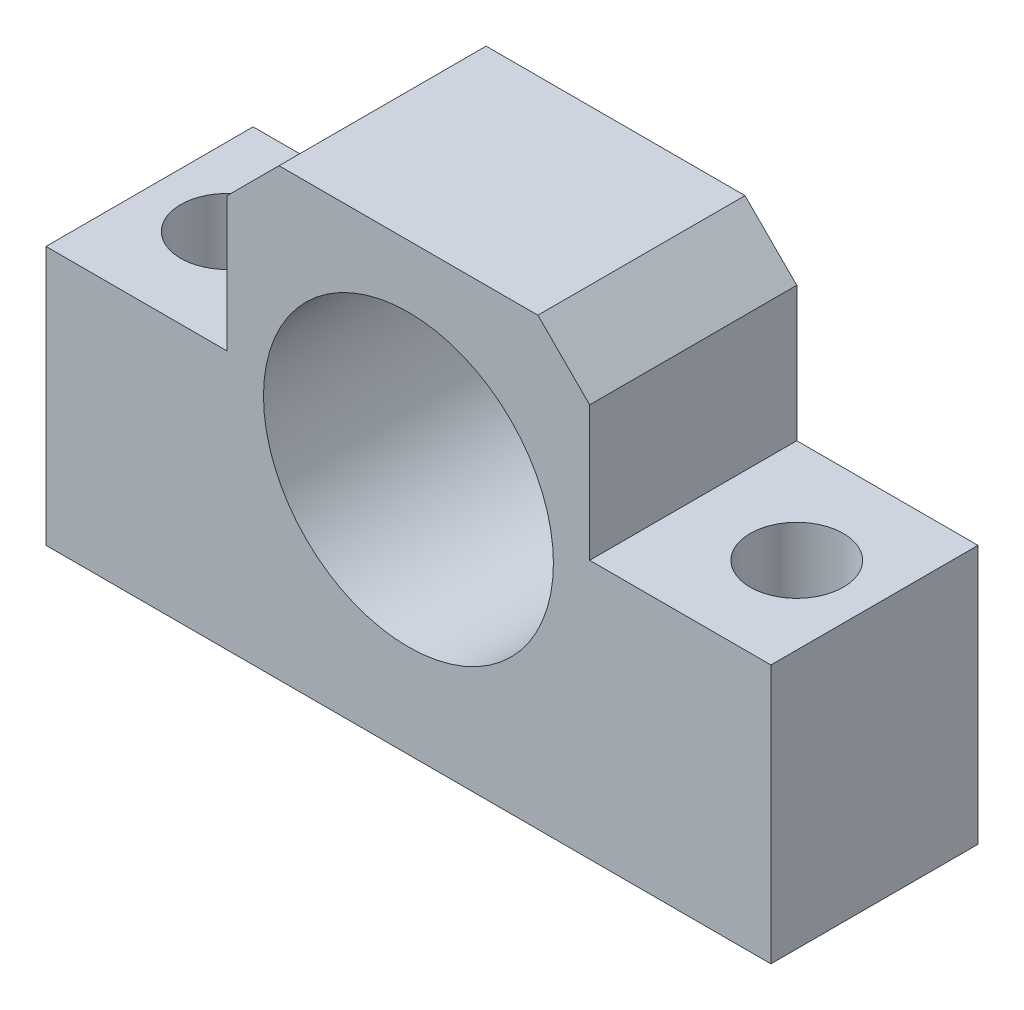
ISO-10303-21;
HEADER;
FILE_DESCRIPTION(('STEP AP214'),'2;1');
FILE_NAME('part.step','',(''),(''),'','','');
FILE_SCHEMA(('AUTOMOTIVE_DESIGN { 1 0 10303 214 1 1 1 1 }'));
ENDSEC;
DATA;
#1=APPLICATION_CONTEXT('core data for automotive mechanical design processes');
#2=APPLICATION_PROTOCOL_DEFINITION('international standard','automotive_design',2000,#1);
#3=PRODUCT_CONTEXT('',#1,'mechanical');
#4=PRODUCT('Part','Part','',(#3));
#5=PRODUCT_RELATED_PRODUCT_CATEGORY('part','',(#4));
#6=PRODUCT_DEFINITION_FORMATION('','',#4);
#7=PRODUCT_DEFINITION_CONTEXT('part definition',#1,'design');
#8=PRODUCT_DEFINITION('design','',#6,#7);
#9=PRODUCT_DEFINITION_SHAPE('','',#8);
#10=(LENGTH_UNIT() NAMED_UNIT(*) SI_UNIT(.MILLI.,.METRE.));
#11=(NAMED_UNIT(*) PLANE_ANGLE_UNIT() SI_UNIT($,.RADIAN.));
#12=(NAMED_UNIT(*) SI_UNIT($,.STERADIAN.) SOLID_ANGLE_UNIT());
#13=UNCERTAINTY_MEASURE_WITH_UNIT(LENGTH_MEASURE(1.E-05),#10,'distance_accuracy_value','');
#14=(GEOMETRIC_REPRESENTATION_CONTEXT(3) GLOBAL_UNCERTAINTY_ASSIGNED_CONTEXT((#13)) GLOBAL_UNIT_ASSIGNED_CONTEXT((#10,
#11,#12)) REPRESENTATION_CONTEXT('',''));
#15=CARTESIAN_POINT('',(0.,0.,0.));
#16=DIRECTION('',(0.,0.,1.));
#17=DIRECTION('',(1.,0.,0.));
#18=AXIS2_PLACEMENT_3D('',#15,#16,#17);
#19=CARTESIAN_POINT('',(-35.,-12.5,0.));
#20=DIRECTION('',(0.,-1.,0.));
#21=DIRECTION('',(0.,0.,-1.));
#22=AXIS2_PLACEMENT_3D('',#19,#20,#21);
#23=PLANE('',#22);
#24=CARTESIAN_POINT('',(-27.5,-12.5,10.));
#25=DIRECTION('',(0.,-1.,0.));
#26=DIRECTION('',(0.,0.,-1.));
#27=AXIS2_PLACEMENT_3D('',#24,#25,#26);
#28=CIRCLE('',#27,4.49999999999999);
#29=CARTESIAN_POINT('',(-27.5,-12.5,5.50000000000002));
#30=VERTEX_POINT('',#29);
#31=EDGE_CURVE('E377',#30,#30,#28,.T.);
#32=ORIENTED_EDGE('',*,*,#31,.F.);
#33=EDGE_LOOP('',(#32));
#34=FACE_BOUND('',#33,.T.);
#35=DIRECTION('',(1.,0.,0.));
#36=VECTOR('',#35,1.);
#37=CARTESIAN_POINT('',(-35.,-12.5,20.));
#38=LINE('',#37,#36);
#39=CARTESIAN_POINT('',(-35.,-12.5,20.));
#40=VERTEX_POINT('',#39);
#41=CARTESIAN_POINT('',(35.,-12.5,20.));
#42=VERTEX_POINT('',#41);
#43=EDGE_CURVE('E151',#40,#42,#38,.T.);
#44=ORIENTED_EDGE('',*,*,#43,.F.);
#45=DIRECTION('',(0.,0.,1.));
#46=VECTOR('',#45,1.);
#47=CARTESIAN_POINT('',(-35.,-12.5,0.));
#48=LINE('',#47,#46);
#49=CARTESIAN_POINT('',(-35.,-12.5,0.));
#50=VERTEX_POINT('',#49);
#51=EDGE_CURVE('E169',#50,#40,#48,.T.);
#52=ORIENTED_EDGE('',*,*,#51,.F.);
#53=DIRECTION('',(1.,0.,0.));
#54=VECTOR('',#53,1.);
#55=CARTESIAN_POINT('',(-35.,-12.5,0.));
#56=LINE('',#55,#54);
#57=CARTESIAN_POINT('',(35.,-12.5,0.));
#58=VERTEX_POINT('',#57);
#59=EDGE_CURVE('E240',#50,#58,#56,.T.);
#60=ORIENTED_EDGE('',*,*,#59,.T.);
#61=DIRECTION('',(0.,0.,1.));
#62=VECTOR('',#61,1.);
#63=CARTESIAN_POINT('',(35.,-12.5,0.));
#64=LINE('',#63,#62);
#65=EDGE_CURVE('E165',#58,#42,#64,.T.);
#66=ORIENTED_EDGE('',*,*,#65,.T.);
#67=EDGE_LOOP('',(#44,#52,#60,#66));
#68=FACE_BOUND('',#67,.T.);
#69=CARTESIAN_POINT('',(27.5,-12.5,10.));
#70=DIRECTION('',(0.,1.,0.));
#71=DIRECTION('',(0.,0.,1.));
#72=AXIS2_PLACEMENT_3D('',#69,#70,#71);
#73=CIRCLE('',#72,4.49999999999998);
#74=CARTESIAN_POINT('',(27.5,-12.5,14.5));
#75=VERTEX_POINT('',#74);
#76=EDGE_CURVE('E212',#75,#75,#73,.T.);
#77=ORIENTED_EDGE('',*,*,#76,.T.);
#78=EDGE_LOOP('',(#77));
#79=FACE_BOUND('',#78,.T.);
#80=ADVANCED_FACE('F45',(#34,#68,#79),#23,.T.);
#81=CARTESIAN_POINT('',(35.,30.5,0.));
#82=DIRECTION('',(0.,1.,0.));
#83=DIRECTION('',(-1.,0.,0.));
#84=AXIS2_PLACEMENT_3D('',#81,#82,#83);
#85=PLANE('',#84);
#86=DIRECTION('',(-1.,0.,0.));
#87=VECTOR('',#86,1.);
#88=CARTESIAN_POINT('',(35.,30.5,20.));
#89=LINE('',#88,#87);
#90=CARTESIAN_POINT('',(12.5,30.5,20.));
#91=VERTEX_POINT('',#90);
#92=CARTESIAN_POINT('',(-12.5,30.5,20.));
#93=VERTEX_POINT('',#92);
#94=EDGE_CURVE('E192',#91,#93,#89,.T.);
#95=ORIENTED_EDGE('',*,*,#94,.F.);
#96=DIRECTION('',(0.,0.,-1.));
#97=VECTOR('',#96,1.);
#98=CARTESIAN_POINT('',(12.5,30.5,0.));
#99=LINE('',#98,#97);
#100=CARTESIAN_POINT('',(12.5,30.5,0.));
#101=VERTEX_POINT('',#100);
#102=EDGE_CURVE('E175',#91,#101,#99,.T.);
#103=ORIENTED_EDGE('',*,*,#102,.T.);
#104=DIRECTION('',(-1.,0.,0.));
#105=VECTOR('',#104,1.);
#106=CARTESIAN_POINT('',(35.,30.5,0.));
#107=LINE('',#106,#105);
#108=CARTESIAN_POINT('',(-12.5,30.5,0.));
#109=VERTEX_POINT('',#108);
#110=EDGE_CURVE('E153',#101,#109,#107,.T.);
#111=ORIENTED_EDGE('',*,*,#110,.T.);
#112=DIRECTION('',(0.,0.,1.));
#113=VECTOR('',#112,1.);
#114=CARTESIAN_POINT('',(-12.5,30.5,20.));
#115=LINE('',#114,#113);
#116=EDGE_CURVE('E168',#109,#93,#115,.T.);
#117=ORIENTED_EDGE('',*,*,#116,.T.);
#118=EDGE_LOOP('',(#95,#103,#111,#117));
#119=FACE_BOUND('',#118,.T.);
#120=ADVANCED_FACE('F196',(#119),#85,.T.);
#121=CARTESIAN_POINT('',(35.,-12.5,0.));
#122=DIRECTION('',(1.,0.,0.));
#123=DIRECTION('',(0.,0.,-1.));
#124=AXIS2_PLACEMENT_3D('',#121,#122,#123);
#125=PLANE('',#124);
#126=DIRECTION('',(0.,0.,-1.));
#127=VECTOR('',#126,1.);
#128=CARTESIAN_POINT('',(35.,12.5,20.));
#129=LINE('',#128,#127);
#130=CARTESIAN_POINT('',(35.,12.5,20.));
#131=VERTEX_POINT('',#130);
#132=CARTESIAN_POINT('',(35.,12.5,0.));
#133=VERTEX_POINT('',#132);
#134=EDGE_CURVE('E130',#131,#133,#129,.T.);
#135=ORIENTED_EDGE('',*,*,#134,.F.);
#136=DIRECTION('',(0.,1.,0.));
#137=VECTOR('',#136,1.);
#138=CARTESIAN_POINT('',(35.,-12.5,20.));
#139=LINE('',#138,#137);
#140=EDGE_CURVE('E142',#42,#131,#139,.T.);
#141=ORIENTED_EDGE('',*,*,#140,.F.);
#142=ORIENTED_EDGE('',*,*,#65,.F.);
#143=DIRECTION('',(0.,1.,0.));
#144=VECTOR('',#143,1.);
#145=CARTESIAN_POINT('',(35.,-12.5,0.));
#146=LINE('',#145,#144);
#147=EDGE_CURVE('E144',#58,#133,#146,.T.);
#148=ORIENTED_EDGE('',*,*,#147,.T.);
#149=EDGE_LOOP('',(#135,#141,#142,#148));
#150=FACE_BOUND('',#149,.T.);
#151=ADVANCED_FACE('F141',(#150),#125,.T.);
#152=CARTESIAN_POINT('',(-35.,30.5,0.));
#153=DIRECTION('',(-1.,0.,0.));
#154=DIRECTION('',(0.,0.,1.));
#155=AXIS2_PLACEMENT_3D('',#152,#153,#154);
#156=PLANE('',#155);
#157=DIRECTION('',(0.,0.,-1.));
#158=VECTOR('',#157,1.);
#159=CARTESIAN_POINT('',(-35.,12.5,20.));
#160=LINE('',#159,#158);
#161=CARTESIAN_POINT('',(-35.,12.5,20.));
#162=VERTEX_POINT('',#161);
#163=CARTESIAN_POINT('',(-35.,12.5,0.));
#164=VERTEX_POINT('',#163);
#165=EDGE_CURVE('E200',#162,#164,#160,.T.);
#166=ORIENTED_EDGE('',*,*,#165,.T.);
#167=DIRECTION('',(0.,-1.,0.));
#168=VECTOR('',#167,1.);
#169=CARTESIAN_POINT('',(-35.,30.5,0.));
#170=LINE('',#169,#168);
#171=EDGE_CURVE('E159',#164,#50,#170,.T.);
#172=ORIENTED_EDGE('',*,*,#171,.T.);
#173=ORIENTED_EDGE('',*,*,#51,.T.);
#174=DIRECTION('',(0.,-1.,0.));
#175=VECTOR('',#174,1.);
#176=CARTESIAN_POINT('',(-35.,30.5,20.));
#177=LINE('',#176,#175);
#178=EDGE_CURVE('E161',#162,#40,#177,.T.);
#179=ORIENTED_EDGE('',*,*,#178,.F.);
#180=EDGE_LOOP('',(#166,#172,#173,#179));
#181=FACE_BOUND('',#180,.T.);
#182=ADVANCED_FACE('F251',(#181),#156,.T.);
#183=CARTESIAN_POINT('',(0.,0.,0.));
#184=DIRECTION('',(0.,0.,1.));
#185=DIRECTION('',(1.,0.,0.));
#186=AXIS2_PLACEMENT_3D('',#183,#184,#185);
#187=PLANE('',#186);
#188=CARTESIAN_POINT('',(0.,10.5,0.));
#189=DIRECTION('',(0.,0.,-1.));
#190=DIRECTION('',(-1.,0.,0.));
#191=AXIS2_PLACEMENT_3D('',#188,#189,#190);
#192=CIRCLE('',#191,14.);
#193=CARTESIAN_POINT('',(-14.,10.5,0.));
#194=VERTEX_POINT('',#193);
#195=EDGE_CURVE('E416',#194,#194,#192,.T.);
#196=ORIENTED_EDGE('',*,*,#195,.F.);
#197=EDGE_LOOP('',(#196));
#198=FACE_BOUND('',#197,.T.);
#199=ORIENTED_EDGE('',*,*,#110,.F.);
#200=DIRECTION('',(0.707106781186545,-0.707106781186549,0.));
#201=VECTOR('',#200,1.);
#202=CARTESIAN_POINT('',(12.5,30.5,0.));
#203=LINE('',#202,#201);
#204=CARTESIAN_POINT('',(17.5,25.5,0.));
#205=VERTEX_POINT('',#204);
#206=EDGE_CURVE('E182',#101,#205,#203,.T.);
#207=ORIENTED_EDGE('',*,*,#206,.T.);
#208=DIRECTION('',(0.,1.,0.));
#209=VECTOR('',#208,1.);
#210=CARTESIAN_POINT('',(17.5,12.5,0.));
#211=LINE('',#210,#209);
#212=CARTESIAN_POINT('',(17.5,12.5,0.));
#213=VERTEX_POINT('',#212);
#214=EDGE_CURVE('E136',#213,#205,#211,.T.);
#215=ORIENTED_EDGE('',*,*,#214,.F.);
#216=DIRECTION('',(-1.,0.,0.));
#217=VECTOR('',#216,1.);
#218=CARTESIAN_POINT('',(35.,12.5,0.));
#219=LINE('',#218,#217);
#220=EDGE_CURVE('E208',#133,#213,#219,.T.);
#221=ORIENTED_EDGE('',*,*,#220,.F.);
#222=ORIENTED_EDGE('',*,*,#147,.F.);
#223=ORIENTED_EDGE('',*,*,#59,.F.);
#224=ORIENTED_EDGE('',*,*,#171,.F.);
#225=DIRECTION('',(-1.,0.,0.));
#226=VECTOR('',#225,1.);
#227=CARTESIAN_POINT('',(-17.5,12.5,0.));
#228=LINE('',#227,#226);
#229=CARTESIAN_POINT('',(-17.5,12.5,0.));
#230=VERTEX_POINT('',#229);
#231=EDGE_CURVE('E223',#230,#164,#228,.T.);
#232=ORIENTED_EDGE('',*,*,#231,.F.);
#233=DIRECTION('',(0.,-1.,0.));
#234=VECTOR('',#233,1.);
#235=CARTESIAN_POINT('',(-17.5,30.5,0.));
#236=LINE('',#235,#234);
#237=CARTESIAN_POINT('',(-17.5,25.5,0.));
#238=VERTEX_POINT('',#237);
#239=EDGE_CURVE('E217',#238,#230,#236,.T.);
#240=ORIENTED_EDGE('',*,*,#239,.F.);
#241=DIRECTION('',(0.707106781186549,0.707106781186546,0.));
#242=VECTOR('',#241,1.);
#243=CARTESIAN_POINT('',(-17.5,25.5,0.));
#244=LINE('',#243,#242);
#245=EDGE_CURVE('E179',#238,#109,#244,.T.);
#246=ORIENTED_EDGE('',*,*,#245,.T.);
#247=EDGE_LOOP('',(#199,#207,#215,#221,#222,#223,#224,#232,#240,#246));
#248=FACE_BOUND('',#247,.T.);
#249=ADVANCED_FACE('F205',(#198,#248),#187,.F.);
#250=CARTESIAN_POINT('',(0.,0.,20.));
#251=DIRECTION('',(0.,0.,1.));
#252=DIRECTION('',(1.,0.,0.));
#253=AXIS2_PLACEMENT_3D('',#250,#251,#252);
#254=PLANE('',#253);
#255=DIRECTION('',(0.,1.,0.));
#256=VECTOR('',#255,1.);
#257=CARTESIAN_POINT('',(17.5,12.5,20.));
#258=LINE('',#257,#256);
#259=CARTESIAN_POINT('',(17.5,12.5,20.));
#260=VERTEX_POINT('',#259);
#261=CARTESIAN_POINT('',(17.5,25.5,20.));
#262=VERTEX_POINT('',#261);
#263=EDGE_CURVE('E135',#260,#262,#258,.T.);
#264=ORIENTED_EDGE('',*,*,#263,.T.);
#265=DIRECTION('',(-0.707106781186545,0.707106781186549,0.));
#266=VECTOR('',#265,1.);
#267=CARTESIAN_POINT('',(21.5,21.4999999999999,20.));
#268=LINE('',#267,#266);
#269=EDGE_CURVE('E55',#262,#91,#268,.T.);
#270=ORIENTED_EDGE('',*,*,#269,.T.);
#271=ORIENTED_EDGE('',*,*,#94,.T.);
#272=DIRECTION('',(-0.707106781186549,-0.707106781186546,0.));
#273=VECTOR('',#272,1.);
#274=CARTESIAN_POINT('',(-21.4999999999999,21.5000000000001,20.));
#275=LINE('',#274,#273);
#276=CARTESIAN_POINT('',(-17.5,25.5,20.));
#277=VERTEX_POINT('',#276);
#278=EDGE_CURVE('E62',#93,#277,#275,.T.);
#279=ORIENTED_EDGE('',*,*,#278,.T.);
#280=DIRECTION('',(0.,-1.,0.));
#281=VECTOR('',#280,1.);
#282=CARTESIAN_POINT('',(-17.5,30.5,20.));
#283=LINE('',#282,#281);
#284=CARTESIAN_POINT('',(-17.5,12.5,20.));
#285=VERTEX_POINT('',#284);
#286=EDGE_CURVE('E219',#277,#285,#283,.T.);
#287=ORIENTED_EDGE('',*,*,#286,.T.);
#288=DIRECTION('',(-1.,0.,0.));
#289=VECTOR('',#288,1.);
#290=CARTESIAN_POINT('',(-17.5,12.5,20.));
#291=LINE('',#290,#289);
#292=EDGE_CURVE('E222',#285,#162,#291,.T.);
#293=ORIENTED_EDGE('',*,*,#292,.T.);
#294=ORIENTED_EDGE('',*,*,#178,.T.);
#295=ORIENTED_EDGE('',*,*,#43,.T.);
#296=ORIENTED_EDGE('',*,*,#140,.T.);
#297=DIRECTION('',(-1.,0.,0.));
#298=VECTOR('',#297,1.);
#299=CARTESIAN_POINT('',(35.,12.5,20.));
#300=LINE('',#299,#298);
#301=EDGE_CURVE('E126',#131,#260,#300,.T.);
#302=ORIENTED_EDGE('',*,*,#301,.T.);
#303=EDGE_LOOP('',(#264,#270,#271,#279,#287,#293,#294,#295,#296,#302));
#304=FACE_BOUND('',#303,.T.);
#305=CARTESIAN_POINT('',(0.,10.5,20.));
#306=DIRECTION('',(0.,0.,1.));
#307=DIRECTION('',(1.,0.,0.));
#308=AXIS2_PLACEMENT_3D('',#305,#306,#307);
#309=CIRCLE('',#308,14.);
#310=CARTESIAN_POINT('',(-14.,10.5,20.));
#311=VERTEX_POINT('',#310);
#312=EDGE_CURVE('E389',#311,#311,#309,.T.);
#313=ORIENTED_EDGE('',*,*,#312,.F.);
#314=EDGE_LOOP('',(#313));
#315=FACE_BOUND('',#314,.T.);
#316=ADVANCED_FACE('F148',(#304,#315),#254,.T.);
#317=CARTESIAN_POINT('',(-17.5,12.5,20.));
#318=DIRECTION('',(0.,-1.,0.));
#319=DIRECTION('',(0.,0.,-1.));
#320=AXIS2_PLACEMENT_3D('',#317,#318,#319);
#321=PLANE('',#320);
#322=CARTESIAN_POINT('',(-27.5,12.5,10.));
#323=DIRECTION('',(0.,-1.,0.));
#324=DIRECTION('',(0.,0.,-1.));
#325=AXIS2_PLACEMENT_3D('',#322,#323,#324);
#326=CIRCLE('',#325,4.49999999999999);
#327=CARTESIAN_POINT('',(-27.5,12.5,5.50000000000002));
#328=VERTEX_POINT('',#327);
#329=EDGE_CURVE('E380',#328,#328,#326,.T.);
#330=ORIENTED_EDGE('',*,*,#329,.T.);
#331=EDGE_LOOP('',(#330));
#332=FACE_BOUND('',#331,.T.);
#333=ORIENTED_EDGE('',*,*,#231,.T.);
#334=ORIENTED_EDGE('',*,*,#165,.F.);
#335=ORIENTED_EDGE('',*,*,#292,.F.);
#336=DIRECTION('',(0.,0.,-1.));
#337=VECTOR('',#336,1.);
#338=CARTESIAN_POINT('',(-17.5,12.5,20.));
#339=LINE('',#338,#337);
#340=EDGE_CURVE('E227',#285,#230,#339,.T.);
#341=ORIENTED_EDGE('',*,*,#340,.T.);
#342=EDGE_LOOP('',(#333,#334,#335,#341));
#343=FACE_BOUND('',#342,.T.);
#344=ADVANCED_FACE('F259',(#332,#343),#321,.F.);
#345=CARTESIAN_POINT('',(-17.5,30.5,20.));
#346=DIRECTION('',(1.,0.,0.));
#347=DIRECTION('',(0.,0.,-1.));
#348=AXIS2_PLACEMENT_3D('',#345,#346,#347);
#349=PLANE('',#348);
#350=ORIENTED_EDGE('',*,*,#286,.F.);
#351=DIRECTION('',(0.,0.,-1.));
#352=VECTOR('',#351,1.);
#353=CARTESIAN_POINT('',(-17.5,25.5,0.));
#354=LINE('',#353,#352);
#355=EDGE_CURVE('E11',#277,#238,#354,.T.);
#356=ORIENTED_EDGE('',*,*,#355,.T.);
#357=ORIENTED_EDGE('',*,*,#239,.T.);
#358=ORIENTED_EDGE('',*,*,#340,.F.);
#359=EDGE_LOOP('',(#350,#356,#357,#358));
#360=FACE_BOUND('',#359,.T.);
#361=ADVANCED_FACE('F262',(#360),#349,.F.);
#362=CARTESIAN_POINT('',(17.5,12.5,20.));
#363=DIRECTION('',(-1.,0.,0.));
#364=DIRECTION('',(0.,-1.,0.));
#365=AXIS2_PLACEMENT_3D('',#362,#363,#364);
#366=PLANE('',#365);
#367=ORIENTED_EDGE('',*,*,#214,.T.);
#368=DIRECTION('',(0.,0.,1.));
#369=VECTOR('',#368,1.);
#370=CARTESIAN_POINT('',(17.5,25.5,20.));
#371=LINE('',#370,#369);
#372=EDGE_CURVE('E70',#205,#262,#371,.T.);
#373=ORIENTED_EDGE('',*,*,#372,.T.);
#374=ORIENTED_EDGE('',*,*,#263,.F.);
#375=DIRECTION('',(0.,0.,-1.));
#376=VECTOR('',#375,1.);
#377=CARTESIAN_POINT('',(17.5,12.5,20.));
#378=LINE('',#377,#376);
#379=EDGE_CURVE('E132',#260,#213,#378,.T.);
#380=ORIENTED_EDGE('',*,*,#379,.T.);
#381=EDGE_LOOP('',(#367,#373,#374,#380));
#382=FACE_BOUND('',#381,.T.);
#383=ADVANCED_FACE('F206',(#382),#366,.F.);
#384=CARTESIAN_POINT('',(35.,12.5,20.));
#385=DIRECTION('',(0.,-1.,0.));
#386=DIRECTION('',(1.,0.,0.));
#387=AXIS2_PLACEMENT_3D('',#384,#385,#386);
#388=PLANE('',#387);
#389=CARTESIAN_POINT('',(27.5,12.5,10.));
#390=DIRECTION('',(0.,1.,0.));
#391=DIRECTION('',(0.,0.,1.));
#392=AXIS2_PLACEMENT_3D('',#389,#390,#391);
#393=CIRCLE('',#392,4.49999999999998);
#394=CARTESIAN_POINT('',(27.5,12.5,14.5));
#395=VERTEX_POINT('',#394);
#396=EDGE_CURVE('E382',#395,#395,#393,.T.);
#397=ORIENTED_EDGE('',*,*,#396,.F.);
#398=EDGE_LOOP('',(#397));
#399=FACE_BOUND('',#398,.T.);
#400=ORIENTED_EDGE('',*,*,#220,.T.);
#401=ORIENTED_EDGE('',*,*,#379,.F.);
#402=ORIENTED_EDGE('',*,*,#301,.F.);
#403=ORIENTED_EDGE('',*,*,#134,.T.);
#404=EDGE_LOOP('',(#400,#401,#402,#403));
#405=FACE_BOUND('',#404,.T.);
#406=ADVANCED_FACE('F129',(#399,#405),#388,.F.);
#407=CARTESIAN_POINT('',(27.5,12.5,10.));
#408=DIRECTION('',(0.,1.,0.));
#409=DIRECTION('',(0.,0.,1.));
#410=AXIS2_PLACEMENT_3D('',#407,#408,#409);
#411=CYLINDRICAL_SURFACE('',#410,4.49999999999998);
#412=ORIENTED_EDGE('',*,*,#76,.F.);
#413=EDGE_LOOP('',(#412));
#414=FACE_BOUND('',#413,.T.);
#415=ORIENTED_EDGE('',*,*,#396,.T.);
#416=EDGE_LOOP('',(#415));
#417=FACE_BOUND('',#416,.T.);
#418=ADVANCED_FACE('F341',(#414,#417),#411,.F.);
#419=CARTESIAN_POINT('',(-27.5,-12.5,10.));
#420=DIRECTION('',(0.,-1.,0.));
#421=DIRECTION('',(0.,0.,-1.));
#422=AXIS2_PLACEMENT_3D('',#419,#420,#421);
#423=CYLINDRICAL_SURFACE('',#422,4.49999999999999);
#424=ORIENTED_EDGE('',*,*,#31,.T.);
#425=EDGE_LOOP('',(#424));
#426=FACE_BOUND('',#425,.T.);
#427=ORIENTED_EDGE('',*,*,#329,.F.);
#428=EDGE_LOOP('',(#427));
#429=FACE_BOUND('',#428,.T.);
#430=ADVANCED_FACE('F275',(#426,#429),#423,.F.);
#431=CARTESIAN_POINT('',(12.5,30.5,0.));
#432=DIRECTION('',(0.707106781186549,0.707106781186546,0.));
#433=DIRECTION('',(0.,0.,1.));
#434=AXIS2_PLACEMENT_3D('',#431,#432,#433);
#435=PLANE('',#434);
#436=ORIENTED_EDGE('',*,*,#269,.F.);
#437=ORIENTED_EDGE('',*,*,#372,.F.);
#438=ORIENTED_EDGE('',*,*,#206,.F.);
#439=ORIENTED_EDGE('',*,*,#102,.F.);
#440=EDGE_LOOP('',(#436,#437,#438,#439));
#441=FACE_BOUND('',#440,.T.);
#442=ADVANCED_FACE('F202',(#441),#435,.T.);
#443=CARTESIAN_POINT('',(-17.5,25.5,20.));
#444=DIRECTION('',(-0.707106781186545,0.707106781186549,0.));
#445=DIRECTION('',(0.,0.,1.));
#446=AXIS2_PLACEMENT_3D('',#443,#444,#445);
#447=PLANE('',#446);
#448=ORIENTED_EDGE('',*,*,#278,.F.);
#449=ORIENTED_EDGE('',*,*,#116,.F.);
#450=ORIENTED_EDGE('',*,*,#245,.F.);
#451=ORIENTED_EDGE('',*,*,#355,.F.);
#452=EDGE_LOOP('',(#448,#449,#450,#451));
#453=FACE_BOUND('',#452,.T.);
#454=ADVANCED_FACE('F48',(#453),#447,.T.);
#455=CARTESIAN_POINT('',(0.,10.5,65.254833995939));
#456=DIRECTION('',(0.,0.,-1.));
#457=DIRECTION('',(-1.,0.,0.));
#458=AXIS2_PLACEMENT_3D('',#455,#456,#457);
#459=CYLINDRICAL_SURFACE('',#458,14.);
#460=CARTESIAN_POINT('',(-14.,10.5,20.));
#461=CARTESIAN_POINT('',(-14.,10.5,19.7916666666667));
#462=CARTESIAN_POINT('',(-14.,10.5,19.5833333333333));
#463=CARTESIAN_POINT('',(-14.,10.5,19.1666666666667));
#464=CARTESIAN_POINT('',(-14.,10.5,18.9583333333333));
#465=CARTESIAN_POINT('',(-14.,10.5,18.5416666666667));
#466=CARTESIAN_POINT('',(-14.,10.5,18.3333333333333));
#467=CARTESIAN_POINT('',(-14.,10.5,17.9166666666667));
#468=CARTESIAN_POINT('',(-14.,10.5,17.7083333333333));
#469=CARTESIAN_POINT('',(-14.,10.5,17.2916666666667));
#470=CARTESIAN_POINT('',(-14.,10.5,17.0833333333333));
#471=CARTESIAN_POINT('',(-14.,10.5,16.6666666666667));
#472=CARTESIAN_POINT('',(-14.,10.5,16.4583333333333));
#473=CARTESIAN_POINT('',(-14.,10.5,16.0416666666667));
#474=CARTESIAN_POINT('',(-14.,10.5,15.8333333333333));
#475=CARTESIAN_POINT('',(-14.,10.5,15.4166666666667));
#476=CARTESIAN_POINT('',(-14.,10.5,15.2083333333333));
#477=CARTESIAN_POINT('',(-14.,10.5,14.7916666666667));
#478=CARTESIAN_POINT('',(-14.,10.5,14.5833333333333));
#479=CARTESIAN_POINT('',(-14.,10.5,14.1666666666667));
#480=CARTESIAN_POINT('',(-14.,10.5,13.9583333333333));
#481=CARTESIAN_POINT('',(-14.,10.5,13.5416666666667));
#482=CARTESIAN_POINT('',(-14.,10.5,13.3333333333333));
#483=CARTESIAN_POINT('',(-14.,10.5,12.9166666666667));
#484=CARTESIAN_POINT('',(-14.,10.5,12.7083333333333));
#485=CARTESIAN_POINT('',(-14.,10.5,12.2916666666667));
#486=CARTESIAN_POINT('',(-14.,10.5,12.0833333333333));
#487=CARTESIAN_POINT('',(-14.,10.5,11.6666666666667));
#488=CARTESIAN_POINT('',(-14.,10.5,11.4583333333333));
#489=CARTESIAN_POINT('',(-14.,10.5,11.0416666666667));
#490=CARTESIAN_POINT('',(-14.,10.5,10.8333333333333));
#491=CARTESIAN_POINT('',(-14.,10.5,10.4166666666667));
#492=CARTESIAN_POINT('',(-14.,10.5,10.2083333333333));
#493=CARTESIAN_POINT('',(-14.,10.5,9.79166666666667));
#494=CARTESIAN_POINT('',(-14.,10.5,9.58333333333333));
#495=CARTESIAN_POINT('',(-14.,10.5,9.16666666666667));
#496=CARTESIAN_POINT('',(-14.,10.5,8.95833333333333));
#497=CARTESIAN_POINT('',(-14.,10.5,8.54166666666667));
#498=CARTESIAN_POINT('',(-14.,10.5,8.33333333333333));
#499=CARTESIAN_POINT('',(-14.,10.5,7.91666666666667));
#500=CARTESIAN_POINT('',(-14.,10.5,7.70833333333333));
#501=CARTESIAN_POINT('',(-14.,10.5,7.29166666666667));
#502=CARTESIAN_POINT('',(-14.,10.5,7.08333333333333));
#503=CARTESIAN_POINT('',(-14.,10.5,6.66666666666666));
#504=CARTESIAN_POINT('',(-14.,10.5,6.45833333333333));
#505=CARTESIAN_POINT('',(-14.,10.5,6.04166666666666));
#506=CARTESIAN_POINT('',(-14.,10.5,5.83333333333333));
#507=CARTESIAN_POINT('',(-14.,10.5,5.41666666666666));
#508=CARTESIAN_POINT('',(-14.,10.5,5.20833333333332));
#509=CARTESIAN_POINT('',(-14.,10.5,4.79166666666666));
#510=CARTESIAN_POINT('',(-14.,10.5,4.58333333333332));
#511=CARTESIAN_POINT('',(-14.,10.5,4.16666666666666));
#512=CARTESIAN_POINT('',(-14.,10.5,3.95833333333332));
#513=CARTESIAN_POINT('',(-14.,10.5,3.54166666666666));
#514=CARTESIAN_POINT('',(-14.,10.5,3.33333333333332));
#515=CARTESIAN_POINT('',(-14.,10.5,2.91666666666666));
#516=CARTESIAN_POINT('',(-14.,10.5,2.70833333333332));
#517=CARTESIAN_POINT('',(-14.,10.5,2.29166666666665));
#518=CARTESIAN_POINT('',(-14.,10.5,2.08333333333332));
#519=CARTESIAN_POINT('',(-14.,10.5,1.66666666666665));
#520=CARTESIAN_POINT('',(-14.,10.5,1.45833333333332));
#521=CARTESIAN_POINT('',(-14.,10.5,1.04166666666665));
#522=CARTESIAN_POINT('',(-14.,10.5,0.83333333333332));
#523=CARTESIAN_POINT('',(-14.,10.5,0.416666666666653));
#524=CARTESIAN_POINT('',(-14.,10.5,0.20833333333332));
#525=CARTESIAN_POINT('',(-14.,10.5,0.));
#526=B_SPLINE_CURVE_WITH_KNOTS('',3,(#460,#461,#462,#463,#464,#465,#466,#467,#468,#469,#470,
#471,#472,#473,#474,#475,#476,#477,#478,#479,#480,#481,#482,#483,#484,#485,#486,#487,#488,#489,
#490,#491,#492,#493,#494,#495,#496,#497,#498,#499,#500,#501,#502,#503,#504,#505,#506,#507,#508,
#509,#510,#511,#512,#513,#514,#515,#516,#517,#518,#519,#520,#521,#522,#523,#524,#525),
.UNSPECIFIED.,.F.,.F.,(4,2,2,2,2,2,2,2,2,2,2,2,2,2,2,2,2,2,2,2,2,2,2,2,2,2,2,2,2,2,2,2,4),(0.,
0.625000000000001,1.25,1.87499999999999,2.5,3.125,3.75,4.375,5.,5.625,6.25000000000001,
6.87500000000001,7.50000000000001,8.12500000000001,8.75000000000001,9.37500000000001,10.,10.625,
11.25,11.875,12.5,13.125,13.75,14.375,15.,15.625,16.25,16.875,17.5,18.125,18.75,19.375,20.),.UNSPECIFIED.);
#527=EDGE_CURVE('BSEAM266',#311,#194,#526,.T.);
#528=ORIENTED_EDGE('',*,*,#312,.T.);
#529=ORIENTED_EDGE('',*,*,#195,.T.);
#530=ORIENTED_EDGE('',*,*,#527,.T.);
#531=ORIENTED_EDGE('',*,*,#527,.F.);
#532=EDGE_LOOP('',(#528,#530,#529,#531));
#533=FACE_BOUND('',#532,.T.);
#534=ADVANCED_FACE('F266',(#533),#459,.F.);
#535=CLOSED_SHELL('',(#80,#120,#151,#182,#249,#316,#344,#361,#383,#406,#418,#430,#442,#454,#534));
#536=MANIFOLD_SOLID_BREP('B2',#535);
#537=ADVANCED_BREP_SHAPE_REPRESENTATION('',(#18,#536),#14);
#538=SHAPE_DEFINITION_REPRESENTATION(#9,#537);
ENDSEC;
END-ISO-10303-21;
